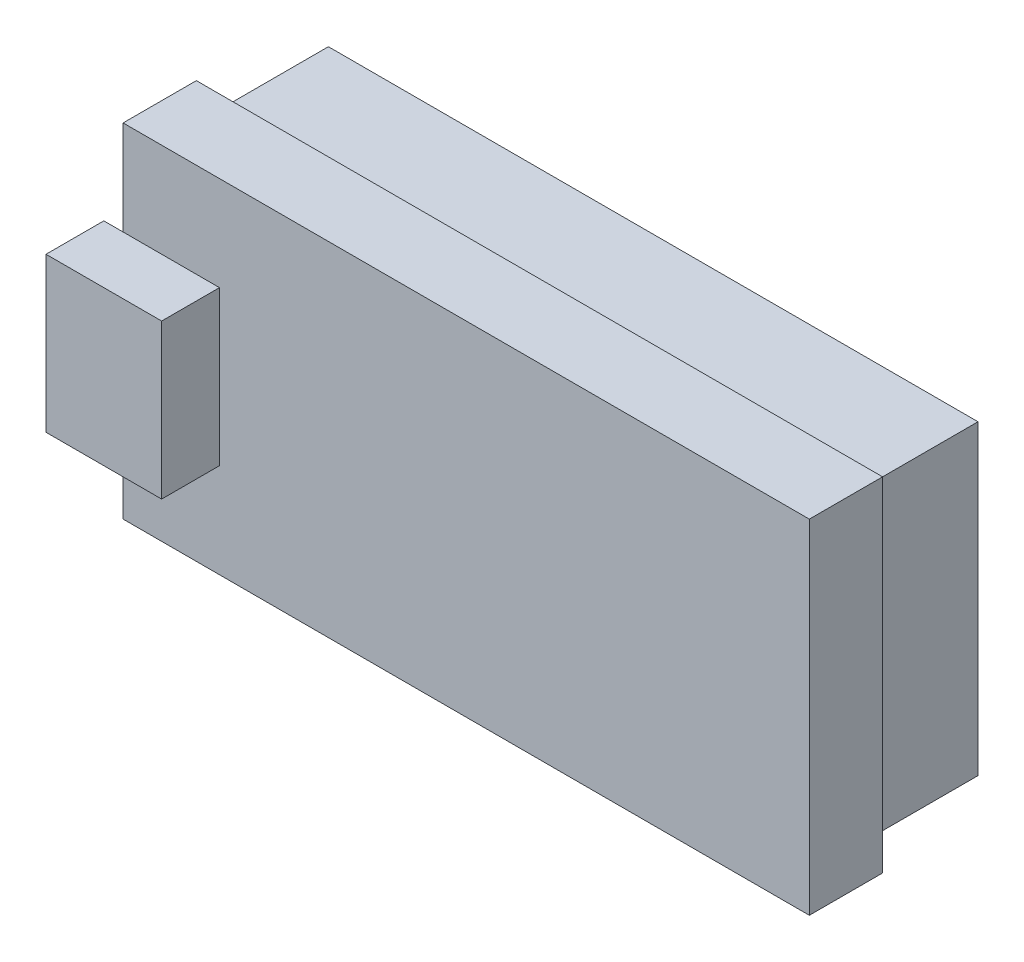
ISO-10303-21;
HEADER;
FILE_DESCRIPTION(('STEP AP214'),'2;1');
FILE_NAME('part.step','',(''),(''),'','','');
FILE_SCHEMA(('AUTOMOTIVE_DESIGN { 1 0 10303 214 1 1 1 1 }'));
ENDSEC;
DATA;
#1=APPLICATION_CONTEXT('core data for automotive mechanical design processes');
#2=APPLICATION_PROTOCOL_DEFINITION('international standard','automotive_design',2000,#1);
#3=PRODUCT_CONTEXT('',#1,'mechanical');
#4=PRODUCT('Part','Part','',(#3));
#5=PRODUCT_RELATED_PRODUCT_CATEGORY('part','',(#4));
#6=PRODUCT_DEFINITION_FORMATION('','',#4);
#7=PRODUCT_DEFINITION_CONTEXT('part definition',#1,'design');
#8=PRODUCT_DEFINITION('design','',#6,#7);
#9=PRODUCT_DEFINITION_SHAPE('','',#8);
#10=(LENGTH_UNIT() NAMED_UNIT(*) SI_UNIT(.MILLI.,.METRE.));
#11=(NAMED_UNIT(*) PLANE_ANGLE_UNIT() SI_UNIT($,.RADIAN.));
#12=(NAMED_UNIT(*) SI_UNIT($,.STERADIAN.) SOLID_ANGLE_UNIT());
#13=UNCERTAINTY_MEASURE_WITH_UNIT(LENGTH_MEASURE(1.E-05),#10,'distance_accuracy_value','');
#14=(GEOMETRIC_REPRESENTATION_CONTEXT(3) GLOBAL_UNCERTAINTY_ASSIGNED_CONTEXT((#13)) GLOBAL_UNIT_ASSIGNED_CONTEXT((#10,
#11,#12)) REPRESENTATION_CONTEXT('',''));
#15=CARTESIAN_POINT('',(0.,0.,0.));
#16=DIRECTION('',(0.,0.,1.));
#17=DIRECTION('',(1.,0.,0.));
#18=AXIS2_PLACEMENT_3D('',#15,#16,#17);
#19=CARTESIAN_POINT('',(0.,0.,-3.15));
#20=DIRECTION('',(0.,0.,-1.));
#21=DIRECTION('',(-1.,0.,0.));
#22=AXIS2_PLACEMENT_3D('',#19,#20,#21);
#23=PLANE('',#22);
#24=DIRECTION('',(0.,1.,0.));
#25=VECTOR('',#24,1.);
#26=CARTESIAN_POINT('',(-17.8,-6.4,-3.15));
#27=LINE('',#26,#25);
#28=CARTESIAN_POINT('',(-17.8,-8.9,-3.15));
#29=VERTEX_POINT('',#28);
#30=CARTESIAN_POINT('',(-17.8,-6.4,-3.15));
#31=VERTEX_POINT('',#30);
#32=EDGE_CURVE('E251',#29,#31,#27,.T.);
#33=ORIENTED_EDGE('',*,*,#32,.T.);
#34=DIRECTION('',(1.,0.,0.));
#35=VECTOR('',#34,1.);
#36=CARTESIAN_POINT('',(15.3,-6.4,-3.15));
#37=LINE('',#36,#35);
#38=CARTESIAN_POINT('',(15.3,-6.4,-3.15));
#39=VERTEX_POINT('',#38);
#40=EDGE_CURVE('E254',#31,#39,#37,.T.);
#41=ORIENTED_EDGE('',*,*,#40,.T.);
#42=DIRECTION('',(0.,1.,0.));
#43=VECTOR('',#42,1.);
#44=CARTESIAN_POINT('',(15.3,6.4,-3.15));
#45=LINE('',#44,#43);
#46=CARTESIAN_POINT('',(15.3,6.4,-3.15));
#47=VERTEX_POINT('',#46);
#48=EDGE_CURVE('E257',#39,#47,#45,.T.);
#49=ORIENTED_EDGE('',*,*,#48,.T.);
#50=DIRECTION('',(-1.,0.,0.));
#51=VECTOR('',#50,1.);
#52=CARTESIAN_POINT('',(-17.8,6.4,-3.15));
#53=LINE('',#52,#51);
#54=CARTESIAN_POINT('',(-17.8,6.4,-3.15));
#55=VERTEX_POINT('',#54);
#56=EDGE_CURVE('E259',#47,#55,#53,.T.);
#57=ORIENTED_EDGE('',*,*,#56,.T.);
#58=DIRECTION('',(0.,1.,0.));
#59=VECTOR('',#58,1.);
#60=CARTESIAN_POINT('',(-17.8,8.9,-3.15));
#61=LINE('',#60,#59);
#62=CARTESIAN_POINT('',(-17.8,8.9,-3.15));
#63=VERTEX_POINT('',#62);
#64=EDGE_CURVE('E261',#55,#63,#61,.T.);
#65=ORIENTED_EDGE('',*,*,#64,.T.);
#66=DIRECTION('',(1.,0.,0.));
#67=VECTOR('',#66,1.);
#68=CARTESIAN_POINT('',(-17.8,8.9,-3.15));
#69=LINE('',#68,#67);
#70=CARTESIAN_POINT('',(17.8,8.9,-3.15));
#71=VERTEX_POINT('',#70);
#72=EDGE_CURVE('E264',#63,#71,#69,.T.);
#73=ORIENTED_EDGE('',*,*,#72,.T.);
#74=DIRECTION('',(0.,-1.,0.));
#75=VECTOR('',#74,1.);
#76=CARTESIAN_POINT('',(17.8,8.9,-3.15));
#77=LINE('',#76,#75);
#78=CARTESIAN_POINT('',(17.8,-8.9,-3.15));
#79=VERTEX_POINT('',#78);
#80=EDGE_CURVE('E267',#71,#79,#77,.T.);
#81=ORIENTED_EDGE('',*,*,#80,.T.);
#82=DIRECTION('',(-1.,0.,0.));
#83=VECTOR('',#82,1.);
#84=CARTESIAN_POINT('',(17.8,-8.9,-3.15));
#85=LINE('',#84,#83);
#86=EDGE_CURVE('E270',#79,#29,#85,.T.);
#87=ORIENTED_EDGE('',*,*,#86,.T.);
#88=EDGE_LOOP('',(#33,#41,#49,#57,#65,#73,#81,#87));
#89=FACE_BOUND('',#88,.T.);
#90=DIRECTION('',(0.,1.,0.));
#91=VECTOR('',#90,1.);
#92=CARTESIAN_POINT('',(-16.85,-7.95,-3.15));
#93=LINE('',#92,#91);
#94=CARTESIAN_POINT('',(-16.85,-7.95,-3.15));
#95=VERTEX_POINT('',#94);
#96=CARTESIAN_POINT('',(-16.85,-7.35,-3.15));
#97=VERTEX_POINT('',#96);
#98=EDGE_CURVE('E203',#95,#97,#93,.T.);
#99=ORIENTED_EDGE('',*,*,#98,.F.);
#100=DIRECTION('',(-1.,0.,0.));
#101=VECTOR('',#100,1.);
#102=CARTESIAN_POINT('',(16.85,-7.95,-3.15));
#103=LINE('',#102,#101);
#104=CARTESIAN_POINT('',(16.85,-7.95,-3.15));
#105=VERTEX_POINT('',#104);
#106=EDGE_CURVE('E211',#105,#95,#103,.T.);
#107=ORIENTED_EDGE('',*,*,#106,.F.);
#108=DIRECTION('',(0.,-1.,0.));
#109=VECTOR('',#108,1.);
#110=CARTESIAN_POINT('',(16.85,7.95,-3.15));
#111=LINE('',#110,#109);
#112=CARTESIAN_POINT('',(16.85,7.95,-3.15));
#113=VERTEX_POINT('',#112);
#114=EDGE_CURVE('E237',#113,#105,#111,.T.);
#115=ORIENTED_EDGE('',*,*,#114,.F.);
#116=DIRECTION('',(1.,0.,0.));
#117=VECTOR('',#116,1.);
#118=CARTESIAN_POINT('',(-16.85,7.95,-3.15));
#119=LINE('',#118,#117);
#120=CARTESIAN_POINT('',(-16.85,7.95,-3.15));
#121=VERTEX_POINT('',#120);
#122=EDGE_CURVE('E234',#121,#113,#119,.T.);
#123=ORIENTED_EDGE('',*,*,#122,.F.);
#124=DIRECTION('',(0.,1.,0.));
#125=VECTOR('',#124,1.);
#126=CARTESIAN_POINT('',(-16.85,7.35,-3.15));
#127=LINE('',#126,#125);
#128=CARTESIAN_POINT('',(-16.85,7.35,-3.15));
#129=VERTEX_POINT('',#128);
#130=EDGE_CURVE('E231',#129,#121,#127,.T.);
#131=ORIENTED_EDGE('',*,*,#130,.F.);
#132=DIRECTION('',(-1.,0.,0.));
#133=VECTOR('',#132,1.);
#134=CARTESIAN_POINT('',(16.25,7.35,-3.15));
#135=LINE('',#134,#133);
#136=CARTESIAN_POINT('',(16.25,7.35,-3.15));
#137=VERTEX_POINT('',#136);
#138=EDGE_CURVE('E228',#137,#129,#135,.T.);
#139=ORIENTED_EDGE('',*,*,#138,.F.);
#140=DIRECTION('',(0.,1.,0.));
#141=VECTOR('',#140,1.);
#142=CARTESIAN_POINT('',(16.25,-7.35,-3.15));
#143=LINE('',#142,#141);
#144=CARTESIAN_POINT('',(16.25,-7.35,-3.15));
#145=VERTEX_POINT('',#144);
#146=EDGE_CURVE('E223',#145,#137,#143,.T.);
#147=ORIENTED_EDGE('',*,*,#146,.F.);
#148=DIRECTION('',(1.,0.,0.));
#149=VECTOR('',#148,1.);
#150=CARTESIAN_POINT('',(-16.85,-7.35,-3.15));
#151=LINE('',#150,#149);
#152=EDGE_CURVE('E221',#97,#145,#151,.T.);
#153=ORIENTED_EDGE('',*,*,#152,.F.);
#154=EDGE_LOOP('',(#99,#107,#115,#123,#131,#139,#147,#153));
#155=FACE_BOUND('',#154,.T.);
#156=ADVANCED_FACE('F33',(#89,#155),#23,.T.);
#157=CARTESIAN_POINT('',(0.,0.,-0.65));
#158=DIRECTION('',(0.,0.,1.));
#159=DIRECTION('',(1.,0.,0.));
#160=AXIS2_PLACEMENT_3D('',#157,#158,#159);
#161=PLANE('',#160);
#162=DIRECTION('',(-1.,0.,0.));
#163=VECTOR('',#162,1.);
#164=CARTESIAN_POINT('',(-17.8,6.4,-0.65));
#165=LINE('',#164,#163);
#166=CARTESIAN_POINT('',(15.3,6.4,-0.65));
#167=VERTEX_POINT('',#166);
#168=CARTESIAN_POINT('',(-17.8,6.4,-0.65));
#169=VERTEX_POINT('',#168);
#170=EDGE_CURVE('E255',#167,#169,#165,.T.);
#171=ORIENTED_EDGE('',*,*,#170,.F.);
#172=DIRECTION('',(0.,1.,0.));
#173=VECTOR('',#172,1.);
#174=CARTESIAN_POINT('',(15.3,6.4,-0.65));
#175=LINE('',#174,#173);
#176=CARTESIAN_POINT('',(15.3,-6.4,-0.65));
#177=VERTEX_POINT('',#176);
#178=EDGE_CURVE('E276',#177,#167,#175,.T.);
#179=ORIENTED_EDGE('',*,*,#178,.F.);
#180=DIRECTION('',(1.,0.,0.));
#181=VECTOR('',#180,1.);
#182=CARTESIAN_POINT('',(15.3,-6.4,-0.65));
#183=LINE('',#182,#181);
#184=CARTESIAN_POINT('',(-17.8,-6.4,-0.65));
#185=VERTEX_POINT('',#184);
#186=EDGE_CURVE('E207',#185,#177,#183,.T.);
#187=ORIENTED_EDGE('',*,*,#186,.F.);
#188=DIRECTION('',(0.,-1.,0.));
#189=VECTOR('',#188,1.);
#190=CARTESIAN_POINT('',(-17.8,8.9,-0.65));
#191=LINE('',#190,#189);
#192=EDGE_CURVE('E327',#169,#185,#191,.T.);
#193=ORIENTED_EDGE('',*,*,#192,.F.);
#194=EDGE_LOOP('',(#171,#179,#187,#193));
#195=FACE_BOUND('',#194,.T.);
#196=ADVANCED_FACE('F459',(#195),#161,.F.);
#197=CARTESIAN_POINT('',(-17.8,8.9,0.65));
#198=DIRECTION('',(1.,0.,0.));
#199=DIRECTION('',(0.,1.,0.));
#200=AXIS2_PLACEMENT_3D('',#197,#198,#199);
#201=PLANE('',#200);
#202=DIRECTION('',(0.,0.,-1.));
#203=VECTOR('',#202,1.);
#204=CARTESIAN_POINT('',(-17.8,8.9,0.65));
#205=LINE('',#204,#203);
#206=CARTESIAN_POINT('',(-17.8,8.9,0.65));
#207=VERTEX_POINT('',#206);
#208=EDGE_CURVE('E339',#207,#63,#205,.T.);
#209=ORIENTED_EDGE('',*,*,#208,.T.);
#210=ORIENTED_EDGE('',*,*,#64,.F.);
#211=DIRECTION('',(0.,0.,1.));
#212=VECTOR('',#211,1.);
#213=CARTESIAN_POINT('',(-17.8,6.4,-3.15));
#214=LINE('',#213,#212);
#215=EDGE_CURVE('E273',#55,#169,#214,.T.);
#216=ORIENTED_EDGE('',*,*,#215,.T.);
#217=ORIENTED_EDGE('',*,*,#192,.T.);
#218=DIRECTION('',(0.,0.,1.));
#219=VECTOR('',#218,1.);
#220=CARTESIAN_POINT('',(-17.8,-6.4,-3.15));
#221=LINE('',#220,#219);
#222=EDGE_CURVE('E289',#31,#185,#221,.T.);
#223=ORIENTED_EDGE('',*,*,#222,.F.);
#224=ORIENTED_EDGE('',*,*,#32,.F.);
#225=DIRECTION('',(0.,0.,-1.));
#226=VECTOR('',#225,1.);
#227=CARTESIAN_POINT('',(-17.8,-8.9,0.65));
#228=LINE('',#227,#226);
#229=CARTESIAN_POINT('',(-17.8,-8.9,0.65));
#230=VERTEX_POINT('',#229);
#231=EDGE_CURVE('E347',#230,#29,#228,.T.);
#232=ORIENTED_EDGE('',*,*,#231,.F.);
#233=DIRECTION('',(0.,-1.,0.));
#234=VECTOR('',#233,1.);
#235=CARTESIAN_POINT('',(-17.8,8.9,0.65));
#236=LINE('',#235,#234);
#237=CARTESIAN_POINT('',(-17.8,-4.,0.65));
#238=VERTEX_POINT('',#237);
#239=EDGE_CURVE('E333',#238,#230,#236,.T.);
#240=ORIENTED_EDGE('',*,*,#239,.F.);
#241=CARTESIAN_POINT('',(-17.8,4.,0.65));
#242=VERTEX_POINT('',#241);
#243=EDGE_CURVE('E332',#242,#238,#236,.T.);
#244=ORIENTED_EDGE('',*,*,#243,.F.);
#245=EDGE_CURVE('E328',#207,#242,#236,.T.);
#246=ORIENTED_EDGE('',*,*,#245,.F.);
#247=EDGE_LOOP('',(#209,#210,#216,#217,#223,#224,#232,#240,#244,#246));
#248=FACE_BOUND('',#247,.T.);
#249=ADVANCED_FACE('F467',(#248),#201,.F.);
#250=CARTESIAN_POINT('',(-17.8,-8.9,0.65));
#251=DIRECTION('',(0.,1.,0.));
#252=DIRECTION('',(0.,0.,1.));
#253=AXIS2_PLACEMENT_3D('',#250,#251,#252);
#254=PLANE('',#253);
#255=ORIENTED_EDGE('',*,*,#231,.T.);
#256=ORIENTED_EDGE('',*,*,#86,.F.);
#257=DIRECTION('',(0.,0.,-1.));
#258=VECTOR('',#257,1.);
#259=CARTESIAN_POINT('',(17.8,-8.9,0.65));
#260=LINE('',#259,#258);
#261=CARTESIAN_POINT('',(17.8,-8.9,0.65));
#262=VERTEX_POINT('',#261);
#263=EDGE_CURVE('E345',#262,#79,#260,.T.);
#264=ORIENTED_EDGE('',*,*,#263,.F.);
#265=DIRECTION('',(1.,0.,0.));
#266=VECTOR('',#265,1.);
#267=CARTESIAN_POINT('',(-17.8,-8.9,0.65));
#268=LINE('',#267,#266);
#269=EDGE_CURVE('E331',#230,#262,#268,.T.);
#270=ORIENTED_EDGE('',*,*,#269,.F.);
#271=EDGE_LOOP('',(#255,#256,#264,#270));
#272=FACE_BOUND('',#271,.T.);
#273=ADVANCED_FACE('F520',(#272),#254,.F.);
#274=CARTESIAN_POINT('',(17.8,8.9,0.65));
#275=DIRECTION('',(-1.,0.,0.));
#276=DIRECTION('',(0.,0.,1.));
#277=AXIS2_PLACEMENT_3D('',#274,#275,#276);
#278=PLANE('',#277);
#279=ORIENTED_EDGE('',*,*,#263,.T.);
#280=ORIENTED_EDGE('',*,*,#80,.F.);
#281=DIRECTION('',(0.,0.,-1.));
#282=VECTOR('',#281,1.);
#283=CARTESIAN_POINT('',(17.8,8.9,0.65));
#284=LINE('',#283,#282);
#285=CARTESIAN_POINT('',(17.8,8.9,0.65));
#286=VERTEX_POINT('',#285);
#287=EDGE_CURVE('E343',#286,#71,#284,.T.);
#288=ORIENTED_EDGE('',*,*,#287,.F.);
#289=DIRECTION('',(0.,1.,0.));
#290=VECTOR('',#289,1.);
#291=CARTESIAN_POINT('',(17.8,8.9,0.65));
#292=LINE('',#291,#290);
#293=EDGE_CURVE('E335',#262,#286,#292,.T.);
#294=ORIENTED_EDGE('',*,*,#293,.F.);
#295=EDGE_LOOP('',(#279,#280,#288,#294));
#296=FACE_BOUND('',#295,.T.);
#297=ADVANCED_FACE('F516',(#296),#278,.F.);
#298=CARTESIAN_POINT('',(-17.8,8.9,0.65));
#299=DIRECTION('',(0.,-1.,0.));
#300=DIRECTION('',(0.,0.,-1.));
#301=AXIS2_PLACEMENT_3D('',#298,#299,#300);
#302=PLANE('',#301);
#303=ORIENTED_EDGE('',*,*,#287,.T.);
#304=ORIENTED_EDGE('',*,*,#72,.F.);
#305=ORIENTED_EDGE('',*,*,#208,.F.);
#306=DIRECTION('',(-1.,0.,0.));
#307=VECTOR('',#306,1.);
#308=CARTESIAN_POINT('',(-17.8,8.9,0.65));
#309=LINE('',#308,#307);
#310=EDGE_CURVE('E337',#286,#207,#309,.T.);
#311=ORIENTED_EDGE('',*,*,#310,.F.);
#312=EDGE_LOOP('',(#303,#304,#305,#311));
#313=FACE_BOUND('',#312,.T.);
#314=ADVANCED_FACE('F511',(#313),#302,.F.);
#315=CARTESIAN_POINT('',(0.,0.,0.65));
#316=DIRECTION('',(0.,0.,1.));
#317=DIRECTION('',(1.,0.,0.));
#318=AXIS2_PLACEMENT_3D('',#315,#316,#317);
#319=PLANE('',#318);
#320=DIRECTION('',(-1.,0.,0.));
#321=VECTOR('',#320,1.);
#322=CARTESIAN_POINT('',(-18.8,4.,0.65));
#323=LINE('',#322,#321);
#324=CARTESIAN_POINT('',(-12.8,4.,0.65));
#325=VERTEX_POINT('',#324);
#326=EDGE_CURVE('E297',#325,#242,#323,.T.);
#327=ORIENTED_EDGE('',*,*,#326,.F.);
#328=DIRECTION('',(0.,1.,0.));
#329=VECTOR('',#328,1.);
#330=CARTESIAN_POINT('',(-12.8,-4.,0.65));
#331=LINE('',#330,#329);
#332=CARTESIAN_POINT('',(-12.8,-4.,0.65));
#333=VERTEX_POINT('',#332);
#334=EDGE_CURVE('E309',#333,#325,#331,.T.);
#335=ORIENTED_EDGE('',*,*,#334,.F.);
#336=DIRECTION('',(1.,0.,0.));
#337=VECTOR('',#336,1.);
#338=CARTESIAN_POINT('',(-18.8,-4.,0.65));
#339=LINE('',#338,#337);
#340=EDGE_CURVE('E310',#238,#333,#339,.T.);
#341=ORIENTED_EDGE('',*,*,#340,.F.);
#342=ORIENTED_EDGE('',*,*,#239,.T.);
#343=ORIENTED_EDGE('',*,*,#269,.T.);
#344=ORIENTED_EDGE('',*,*,#293,.T.);
#345=ORIENTED_EDGE('',*,*,#310,.T.);
#346=ORIENTED_EDGE('',*,*,#245,.T.);
#347=EDGE_LOOP('',(#327,#335,#341,#342,#343,#344,#345,#346));
#348=FACE_BOUND('',#347,.T.);
#349=ADVANCED_FACE('F508',(#348),#319,.T.);
#350=CARTESIAN_POINT('',(-18.8,-4.,3.65));
#351=DIRECTION('',(1.,0.,0.));
#352=DIRECTION('',(0.,0.,-1.));
#353=AXIS2_PLACEMENT_3D('',#350,#351,#352);
#354=PLANE('',#353);
#355=DIRECTION('',(0.,-1.,0.));
#356=VECTOR('',#355,1.);
#357=CARTESIAN_POINT('',(-18.8,-4.,0.65));
#358=LINE('',#357,#356);
#359=CARTESIAN_POINT('',(-18.8,4.,0.65));
#360=VERTEX_POINT('',#359);
#361=CARTESIAN_POINT('',(-18.8,-4.,0.65));
#362=VERTEX_POINT('',#361);
#363=EDGE_CURVE('E292',#360,#362,#358,.T.);
#364=ORIENTED_EDGE('',*,*,#363,.T.);
#365=DIRECTION('',(0.,0.,-1.));
#366=VECTOR('',#365,1.);
#367=CARTESIAN_POINT('',(-18.8,-4.,3.65));
#368=LINE('',#367,#366);
#369=CARTESIAN_POINT('',(-18.8,-4.,3.65));
#370=VERTEX_POINT('',#369);
#371=EDGE_CURVE('E324',#370,#362,#368,.T.);
#372=ORIENTED_EDGE('',*,*,#371,.F.);
#373=DIRECTION('',(0.,-1.,0.));
#374=VECTOR('',#373,1.);
#375=CARTESIAN_POINT('',(-18.8,-4.,3.65));
#376=LINE('',#375,#374);
#377=CARTESIAN_POINT('',(-18.8,4.,3.65));
#378=VERTEX_POINT('',#377);
#379=EDGE_CURVE('E293',#378,#370,#376,.T.);
#380=ORIENTED_EDGE('',*,*,#379,.F.);
#381=DIRECTION('',(0.,0.,-1.));
#382=VECTOR('',#381,1.);
#383=CARTESIAN_POINT('',(-18.8,4.,3.65));
#384=LINE('',#383,#382);
#385=EDGE_CURVE('E303',#378,#360,#384,.T.);
#386=ORIENTED_EDGE('',*,*,#385,.T.);
#387=EDGE_LOOP('',(#364,#372,#380,#386));
#388=FACE_BOUND('',#387,.T.);
#389=ADVANCED_FACE('F504',(#388),#354,.F.);
#390=CARTESIAN_POINT('',(-18.8,-4.,3.65));
#391=DIRECTION('',(0.,1.,0.));
#392=DIRECTION('',(0.,0.,1.));
#393=AXIS2_PLACEMENT_3D('',#390,#391,#392);
#394=PLANE('',#393);
#395=EDGE_CURVE('E306',#362,#238,#339,.T.);
#396=ORIENTED_EDGE('',*,*,#395,.T.);
#397=ORIENTED_EDGE('',*,*,#340,.T.);
#398=DIRECTION('',(0.,0.,-1.));
#399=VECTOR('',#398,1.);
#400=CARTESIAN_POINT('',(-12.8,-4.,3.65));
#401=LINE('',#400,#399);
#402=CARTESIAN_POINT('',(-12.8,-4.,3.65));
#403=VERTEX_POINT('',#402);
#404=EDGE_CURVE('E321',#403,#333,#401,.T.);
#405=ORIENTED_EDGE('',*,*,#404,.F.);
#406=DIRECTION('',(1.,0.,0.));
#407=VECTOR('',#406,1.);
#408=CARTESIAN_POINT('',(-18.8,-4.,3.65));
#409=LINE('',#408,#407);
#410=EDGE_CURVE('E296',#370,#403,#409,.T.);
#411=ORIENTED_EDGE('',*,*,#410,.F.);
#412=ORIENTED_EDGE('',*,*,#371,.T.);
#413=EDGE_LOOP('',(#396,#397,#405,#411,#412));
#414=FACE_BOUND('',#413,.T.);
#415=ADVANCED_FACE('F500',(#414),#394,.F.);
#416=CARTESIAN_POINT('',(-12.8,-4.,3.65));
#417=DIRECTION('',(-1.,0.,0.));
#418=DIRECTION('',(0.,0.,1.));
#419=AXIS2_PLACEMENT_3D('',#416,#417,#418);
#420=PLANE('',#419);
#421=ORIENTED_EDGE('',*,*,#334,.T.);
#422=DIRECTION('',(0.,0.,-1.));
#423=VECTOR('',#422,1.);
#424=CARTESIAN_POINT('',(-12.8,4.,3.65));
#425=LINE('',#424,#423);
#426=CARTESIAN_POINT('',(-12.8,4.,3.65));
#427=VERTEX_POINT('',#426);
#428=EDGE_CURVE('E318',#427,#325,#425,.T.);
#429=ORIENTED_EDGE('',*,*,#428,.F.);
#430=DIRECTION('',(0.,1.,0.));
#431=VECTOR('',#430,1.);
#432=CARTESIAN_POINT('',(-12.8,-4.,3.65));
#433=LINE('',#432,#431);
#434=EDGE_CURVE('E299',#403,#427,#433,.T.);
#435=ORIENTED_EDGE('',*,*,#434,.F.);
#436=ORIENTED_EDGE('',*,*,#404,.T.);
#437=EDGE_LOOP('',(#421,#429,#435,#436));
#438=FACE_BOUND('',#437,.T.);
#439=ADVANCED_FACE('F496',(#438),#420,.F.);
#440=CARTESIAN_POINT('',(-18.8,4.,3.65));
#441=DIRECTION('',(0.,-1.,0.));
#442=DIRECTION('',(0.,0.,-1.));
#443=AXIS2_PLACEMENT_3D('',#440,#441,#442);
#444=PLANE('',#443);
#445=ORIENTED_EDGE('',*,*,#326,.T.);
#446=EDGE_CURVE('E313',#242,#360,#323,.T.);
#447=ORIENTED_EDGE('',*,*,#446,.T.);
#448=ORIENTED_EDGE('',*,*,#385,.F.);
#449=DIRECTION('',(-1.,0.,0.));
#450=VECTOR('',#449,1.);
#451=CARTESIAN_POINT('',(-18.8,4.,3.65));
#452=LINE('',#451,#450);
#453=EDGE_CURVE('E301',#427,#378,#452,.T.);
#454=ORIENTED_EDGE('',*,*,#453,.F.);
#455=ORIENTED_EDGE('',*,*,#428,.T.);
#456=EDGE_LOOP('',(#445,#447,#448,#454,#455));
#457=FACE_BOUND('',#456,.T.);
#458=ADVANCED_FACE('F489',(#457),#444,.F.);
#459=CARTESIAN_POINT('',(0.,0.,3.65));
#460=DIRECTION('',(0.,0.,-1.));
#461=DIRECTION('',(-1.,0.,0.));
#462=AXIS2_PLACEMENT_3D('',#459,#460,#461);
#463=PLANE('',#462);
#464=ORIENTED_EDGE('',*,*,#379,.T.);
#465=ORIENTED_EDGE('',*,*,#410,.T.);
#466=ORIENTED_EDGE('',*,*,#434,.T.);
#467=ORIENTED_EDGE('',*,*,#453,.T.);
#468=EDGE_LOOP('',(#464,#465,#466,#467));
#469=FACE_BOUND('',#468,.T.);
#470=ADVANCED_FACE('F486',(#469),#463,.F.);
#471=CARTESIAN_POINT('',(0.,0.,0.65));
#472=DIRECTION('',(0.,0.,-1.));
#473=DIRECTION('',(-1.,0.,0.));
#474=AXIS2_PLACEMENT_3D('',#471,#472,#473);
#475=PLANE('',#474);
#476=ORIENTED_EDGE('',*,*,#446,.F.);
#477=ORIENTED_EDGE('',*,*,#243,.T.);
#478=ORIENTED_EDGE('',*,*,#395,.F.);
#479=ORIENTED_EDGE('',*,*,#363,.F.);
#480=EDGE_LOOP('',(#476,#477,#478,#479));
#481=FACE_BOUND('',#480,.T.);
#482=ADVANCED_FACE('F484',(#481),#475,.T.);
#483=CARTESIAN_POINT('',(15.3,-6.4,-3.15));
#484=DIRECTION('',(0.,-1.,0.));
#485=DIRECTION('',(0.,0.,-1.));
#486=AXIS2_PLACEMENT_3D('',#483,#484,#485);
#487=PLANE('',#486);
#488=ORIENTED_EDGE('',*,*,#186,.T.);
#489=DIRECTION('',(0.,0.,1.));
#490=VECTOR('',#489,1.);
#491=CARTESIAN_POINT('',(15.3,-6.4,-3.15));
#492=LINE('',#491,#490);
#493=EDGE_CURVE('E286',#39,#177,#492,.T.);
#494=ORIENTED_EDGE('',*,*,#493,.F.);
#495=ORIENTED_EDGE('',*,*,#40,.F.);
#496=ORIENTED_EDGE('',*,*,#222,.T.);
#497=EDGE_LOOP('',(#488,#494,#495,#496));
#498=FACE_BOUND('',#497,.T.);
#499=ADVANCED_FACE('F480',(#498),#487,.F.);
#500=CARTESIAN_POINT('',(15.3,6.4,-3.15));
#501=DIRECTION('',(1.,0.,0.));
#502=DIRECTION('',(0.,0.,-1.));
#503=AXIS2_PLACEMENT_3D('',#500,#501,#502);
#504=PLANE('',#503);
#505=ORIENTED_EDGE('',*,*,#178,.T.);
#506=DIRECTION('',(0.,0.,1.));
#507=VECTOR('',#506,1.);
#508=CARTESIAN_POINT('',(15.3,6.4,-3.15));
#509=LINE('',#508,#507);
#510=EDGE_CURVE('E283',#47,#167,#509,.T.);
#511=ORIENTED_EDGE('',*,*,#510,.F.);
#512=ORIENTED_EDGE('',*,*,#48,.F.);
#513=ORIENTED_EDGE('',*,*,#493,.T.);
#514=EDGE_LOOP('',(#505,#511,#512,#513));
#515=FACE_BOUND('',#514,.T.);
#516=ADVANCED_FACE('F476',(#515),#504,.F.);
#517=CARTESIAN_POINT('',(-17.8,6.4,-3.15));
#518=DIRECTION('',(0.,1.,0.));
#519=DIRECTION('',(0.,0.,1.));
#520=AXIS2_PLACEMENT_3D('',#517,#518,#519);
#521=PLANE('',#520);
#522=ORIENTED_EDGE('',*,*,#170,.T.);
#523=ORIENTED_EDGE('',*,*,#215,.F.);
#524=ORIENTED_EDGE('',*,*,#56,.F.);
#525=ORIENTED_EDGE('',*,*,#510,.T.);
#526=EDGE_LOOP('',(#522,#523,#524,#525));
#527=FACE_BOUND('',#526,.T.);
#528=ADVANCED_FACE('F473',(#527),#521,.F.);
#529=CARTESIAN_POINT('',(16.85,-7.95,-9.25));
#530=DIRECTION('',(0.,1.,0.));
#531=DIRECTION('',(0.,0.,1.));
#532=AXIS2_PLACEMENT_3D('',#529,#530,#531);
#533=PLANE('',#532);
#534=DIRECTION('',(0.,0.,1.));
#535=VECTOR('',#534,1.);
#536=CARTESIAN_POINT('',(-16.85,-7.95,-9.25));
#537=LINE('',#536,#535);
#538=CARTESIAN_POINT('',(-16.85,-7.95,-9.05));
#539=VERTEX_POINT('',#538);
#540=EDGE_CURVE('E199',#539,#95,#537,.T.);
#541=ORIENTED_EDGE('',*,*,#540,.F.);
#542=DIRECTION('',(1.,0.,0.));
#543=VECTOR('',#542,1.);
#544=CARTESIAN_POINT('',(16.85,-7.95,-9.05));
#545=LINE('',#544,#543);
#546=CARTESIAN_POINT('',(16.85,-7.95,-9.05));
#547=VERTEX_POINT('',#546);
#548=EDGE_CURVE('E11',#539,#547,#545,.T.);
#549=ORIENTED_EDGE('',*,*,#548,.T.);
#550=DIRECTION('',(0.,0.,1.));
#551=VECTOR('',#550,1.);
#552=CARTESIAN_POINT('',(16.85,-7.95,-9.25));
#553=LINE('',#552,#551);
#554=EDGE_CURVE('E214',#547,#105,#553,.T.);
#555=ORIENTED_EDGE('',*,*,#554,.T.);
#556=ORIENTED_EDGE('',*,*,#106,.T.);
#557=EDGE_LOOP('',(#541,#549,#555,#556));
#558=FACE_BOUND('',#557,.T.);
#559=ADVANCED_FACE('F212',(#558),#533,.F.);
#560=CARTESIAN_POINT('',(-16.85,-7.95,-9.25));
#561=DIRECTION('',(1.,0.,0.));
#562=DIRECTION('',(0.,1.,0.));
#563=AXIS2_PLACEMENT_3D('',#560,#561,#562);
#564=PLANE('',#563);
#565=DIRECTION('',(0.,0.,1.));
#566=VECTOR('',#565,1.);
#567=CARTESIAN_POINT('',(-16.85,-7.35,-9.25));
#568=LINE('',#567,#566);
#569=CARTESIAN_POINT('',(-16.85,-7.35,-9.05));
#570=VERTEX_POINT('',#569);
#571=EDGE_CURVE('E208',#570,#97,#568,.T.);
#572=ORIENTED_EDGE('',*,*,#571,.F.);
#573=DIRECTION('',(0.,-1.,0.));
#574=VECTOR('',#573,1.);
#575=CARTESIAN_POINT('',(-16.85,-7.95,-9.05));
#576=LINE('',#575,#574);
#577=EDGE_CURVE('E42',#570,#539,#576,.T.);
#578=ORIENTED_EDGE('',*,*,#577,.T.);
#579=ORIENTED_EDGE('',*,*,#540,.T.);
#580=ORIENTED_EDGE('',*,*,#98,.T.);
#581=EDGE_LOOP('',(#572,#578,#579,#580));
#582=FACE_BOUND('',#581,.T.);
#583=ADVANCED_FACE('F201',(#582),#564,.F.);
#584=CARTESIAN_POINT('',(-16.85,-7.35,-9.25));
#585=DIRECTION('',(0.,-1.,0.));
#586=DIRECTION('',(0.,0.,-1.));
#587=AXIS2_PLACEMENT_3D('',#584,#585,#586);
#588=PLANE('',#587);
#589=DIRECTION('',(0.,0.,1.));
#590=VECTOR('',#589,1.);
#591=CARTESIAN_POINT('',(16.25,-7.35,-9.25));
#592=LINE('',#591,#590);
#593=CARTESIAN_POINT('',(16.25,-7.35,-9.05));
#594=VERTEX_POINT('',#593);
#595=EDGE_CURVE('E248',#594,#145,#592,.T.);
#596=ORIENTED_EDGE('',*,*,#595,.F.);
#597=DIRECTION('',(-1.,0.,0.));
#598=VECTOR('',#597,1.);
#599=CARTESIAN_POINT('',(-16.85,-7.35,-9.05));
#600=LINE('',#599,#598);
#601=EDGE_CURVE('E57',#594,#570,#600,.T.);
#602=ORIENTED_EDGE('',*,*,#601,.T.);
#603=ORIENTED_EDGE('',*,*,#571,.T.);
#604=ORIENTED_EDGE('',*,*,#152,.T.);
#605=EDGE_LOOP('',(#596,#602,#603,#604));
#606=FACE_BOUND('',#605,.T.);
#607=ADVANCED_FACE('F412',(#606),#588,.F.);
#608=CARTESIAN_POINT('',(16.25,-7.35,-9.25));
#609=DIRECTION('',(1.,0.,0.));
#610=DIRECTION('',(0.,0.,-1.));
#611=AXIS2_PLACEMENT_3D('',#608,#609,#610);
#612=PLANE('',#611);
#613=DIRECTION('',(0.,0.,1.));
#614=VECTOR('',#613,1.);
#615=CARTESIAN_POINT('',(16.25,7.35,-9.25));
#616=LINE('',#615,#614);
#617=CARTESIAN_POINT('',(16.25,7.35,-9.05));
#618=VERTEX_POINT('',#617);
#619=EDGE_CURVE('E246',#618,#137,#616,.T.);
#620=ORIENTED_EDGE('',*,*,#619,.F.);
#621=DIRECTION('',(0.,-1.,0.));
#622=VECTOR('',#621,1.);
#623=CARTESIAN_POINT('',(16.25,-7.35,-9.05));
#624=LINE('',#623,#622);
#625=EDGE_CURVE('E375',#618,#594,#624,.T.);
#626=ORIENTED_EDGE('',*,*,#625,.T.);
#627=ORIENTED_EDGE('',*,*,#595,.T.);
#628=ORIENTED_EDGE('',*,*,#146,.T.);
#629=EDGE_LOOP('',(#620,#626,#627,#628));
#630=FACE_BOUND('',#629,.T.);
#631=ADVANCED_FACE('F411',(#630),#612,.F.);
#632=CARTESIAN_POINT('',(16.25,7.35,-9.25));
#633=DIRECTION('',(0.,1.,0.));
#634=DIRECTION('',(0.,0.,1.));
#635=AXIS2_PLACEMENT_3D('',#632,#633,#634);
#636=PLANE('',#635);
#637=DIRECTION('',(0.,0.,1.));
#638=VECTOR('',#637,1.);
#639=CARTESIAN_POINT('',(-16.85,7.35,-9.25));
#640=LINE('',#639,#638);
#641=CARTESIAN_POINT('',(-16.85,7.35,-9.05));
#642=VERTEX_POINT('',#641);
#643=EDGE_CURVE('E244',#642,#129,#640,.T.);
#644=ORIENTED_EDGE('',*,*,#643,.F.);
#645=DIRECTION('',(1.,0.,0.));
#646=VECTOR('',#645,1.);
#647=CARTESIAN_POINT('',(16.25,7.35,-9.05));
#648=LINE('',#647,#646);
#649=EDGE_CURVE('E373',#642,#618,#648,.T.);
#650=ORIENTED_EDGE('',*,*,#649,.T.);
#651=ORIENTED_EDGE('',*,*,#619,.T.);
#652=ORIENTED_EDGE('',*,*,#138,.T.);
#653=EDGE_LOOP('',(#644,#650,#651,#652));
#654=FACE_BOUND('',#653,.T.);
#655=ADVANCED_FACE('F418',(#654),#636,.F.);
#656=CARTESIAN_POINT('',(-16.85,7.35,-9.25));
#657=DIRECTION('',(1.,0.,0.));
#658=DIRECTION('',(0.,0.,-1.));
#659=AXIS2_PLACEMENT_3D('',#656,#657,#658);
#660=PLANE('',#659);
#661=DIRECTION('',(0.,0.,1.));
#662=VECTOR('',#661,1.);
#663=CARTESIAN_POINT('',(-16.85,7.95,-9.25));
#664=LINE('',#663,#662);
#665=CARTESIAN_POINT('',(-16.85,7.95,-9.05));
#666=VERTEX_POINT('',#665);
#667=EDGE_CURVE('E242',#666,#121,#664,.T.);
#668=ORIENTED_EDGE('',*,*,#667,.F.);
#669=DIRECTION('',(0.,-1.,0.));
#670=VECTOR('',#669,1.);
#671=CARTESIAN_POINT('',(-16.85,7.35,-9.05));
#672=LINE('',#671,#670);
#673=EDGE_CURVE('E371',#666,#642,#672,.T.);
#674=ORIENTED_EDGE('',*,*,#673,.T.);
#675=ORIENTED_EDGE('',*,*,#643,.T.);
#676=ORIENTED_EDGE('',*,*,#130,.T.);
#677=EDGE_LOOP('',(#668,#674,#675,#676));
#678=FACE_BOUND('',#677,.T.);
#679=ADVANCED_FACE('F421',(#678),#660,.F.);
#680=CARTESIAN_POINT('',(-16.85,7.95,-9.25));
#681=DIRECTION('',(0.,-1.,0.));
#682=DIRECTION('',(0.,0.,-1.));
#683=AXIS2_PLACEMENT_3D('',#680,#681,#682);
#684=PLANE('',#683);
#685=DIRECTION('',(0.,0.,1.));
#686=VECTOR('',#685,1.);
#687=CARTESIAN_POINT('',(16.85,7.95,-9.25));
#688=LINE('',#687,#686);
#689=CARTESIAN_POINT('',(16.85,7.95,-9.05));
#690=VERTEX_POINT('',#689);
#691=EDGE_CURVE('E240',#690,#113,#688,.T.);
#692=ORIENTED_EDGE('',*,*,#691,.F.);
#693=DIRECTION('',(-1.,0.,0.));
#694=VECTOR('',#693,1.);
#695=CARTESIAN_POINT('',(-16.85,7.95,-9.05));
#696=LINE('',#695,#694);
#697=EDGE_CURVE('E369',#690,#666,#696,.T.);
#698=ORIENTED_EDGE('',*,*,#697,.T.);
#699=ORIENTED_EDGE('',*,*,#667,.T.);
#700=ORIENTED_EDGE('',*,*,#122,.T.);
#701=EDGE_LOOP('',(#692,#698,#699,#700));
#702=FACE_BOUND('',#701,.T.);
#703=ADVANCED_FACE('F616',(#702),#684,.F.);
#704=CARTESIAN_POINT('',(16.85,7.95,-9.25));
#705=DIRECTION('',(-1.,0.,0.));
#706=DIRECTION('',(0.,0.,1.));
#707=AXIS2_PLACEMENT_3D('',#704,#705,#706);
#708=PLANE('',#707);
#709=ORIENTED_EDGE('',*,*,#554,.F.);
#710=DIRECTION('',(0.,1.,0.));
#711=VECTOR('',#710,1.);
#712=CARTESIAN_POINT('',(16.85,7.95,-9.05));
#713=LINE('',#712,#711);
#714=EDGE_CURVE('E366',#547,#690,#713,.T.);
#715=ORIENTED_EDGE('',*,*,#714,.T.);
#716=ORIENTED_EDGE('',*,*,#691,.T.);
#717=ORIENTED_EDGE('',*,*,#114,.T.);
#718=EDGE_LOOP('',(#709,#715,#716,#717));
#719=FACE_BOUND('',#718,.T.);
#720=ADVANCED_FACE('F447',(#719),#708,.F.);
#721=CARTESIAN_POINT('',(0.,0.,-9.25));
#722=DIRECTION('',(0.,0.,-1.));
#723=DIRECTION('',(-1.,0.,0.));
#724=AXIS2_PLACEMENT_3D('',#721,#722,#723);
#725=PLANE('',#724);
#726=DIRECTION('',(1.,0.,0.));
#727=VECTOR('',#726,1.);
#728=CARTESIAN_POINT('',(16.85,7.75,-9.25));
#729=LINE('',#728,#727);
#730=CARTESIAN_POINT('',(-16.65,7.75,-9.25));
#731=VERTEX_POINT('',#730);
#732=CARTESIAN_POINT('',(16.65,7.75,-9.25));
#733=VERTEX_POINT('',#732);
#734=EDGE_CURVE('E361',#731,#733,#729,.T.);
#735=ORIENTED_EDGE('',*,*,#734,.T.);
#736=DIRECTION('',(0.,-1.,0.));
#737=VECTOR('',#736,1.);
#738=CARTESIAN_POINT('',(16.65,-7.95,-9.25));
#739=LINE('',#738,#737);
#740=CARTESIAN_POINT('',(16.65,-7.75,-9.25));
#741=VERTEX_POINT('',#740);
#742=EDGE_CURVE('E363',#733,#741,#739,.T.);
#743=ORIENTED_EDGE('',*,*,#742,.T.);
#744=DIRECTION('',(-1.,0.,0.));
#745=VECTOR('',#744,1.);
#746=CARTESIAN_POINT('',(-16.85,-7.75,-9.25));
#747=LINE('',#746,#745);
#748=CARTESIAN_POINT('',(-16.65,-7.75,-9.25));
#749=VERTEX_POINT('',#748);
#750=EDGE_CURVE('E349',#741,#749,#747,.T.);
#751=ORIENTED_EDGE('',*,*,#750,.T.);
#752=DIRECTION('',(0.,1.,0.));
#753=VECTOR('',#752,1.);
#754=CARTESIAN_POINT('',(-16.65,-7.35,-9.25));
#755=LINE('',#754,#753);
#756=CARTESIAN_POINT('',(-16.65,-7.55,-9.25));
#757=VERTEX_POINT('',#756);
#758=EDGE_CURVE('E351',#749,#757,#755,.T.);
#759=ORIENTED_EDGE('',*,*,#758,.T.);
#760=DIRECTION('',(1.,0.,0.));
#761=VECTOR('',#760,1.);
#762=CARTESIAN_POINT('',(16.25,-7.55,-9.25));
#763=LINE('',#762,#761);
#764=CARTESIAN_POINT('',(16.45,-7.55,-9.25));
#765=VERTEX_POINT('',#764);
#766=EDGE_CURVE('E353',#757,#765,#763,.T.);
#767=ORIENTED_EDGE('',*,*,#766,.T.);
#768=DIRECTION('',(0.,1.,0.));
#769=VECTOR('',#768,1.);
#770=CARTESIAN_POINT('',(16.45,7.35,-9.25));
#771=LINE('',#770,#769);
#772=CARTESIAN_POINT('',(16.45,7.55,-9.25));
#773=VERTEX_POINT('',#772);
#774=EDGE_CURVE('E355',#765,#773,#771,.T.);
#775=ORIENTED_EDGE('',*,*,#774,.T.);
#776=DIRECTION('',(-1.,0.,0.));
#777=VECTOR('',#776,1.);
#778=CARTESIAN_POINT('',(-16.85,7.55,-9.25));
#779=LINE('',#778,#777);
#780=CARTESIAN_POINT('',(-16.65,7.55,-9.25));
#781=VERTEX_POINT('',#780);
#782=EDGE_CURVE('E357',#773,#781,#779,.T.);
#783=ORIENTED_EDGE('',*,*,#782,.T.);
#784=DIRECTION('',(0.,1.,0.));
#785=VECTOR('',#784,1.);
#786=CARTESIAN_POINT('',(-16.65,7.95,-9.25));
#787=LINE('',#786,#785);
#788=EDGE_CURVE('E359',#781,#731,#787,.T.);
#789=ORIENTED_EDGE('',*,*,#788,.T.);
#790=EDGE_LOOP('',(#735,#743,#751,#759,#767,#775,#783,#789));
#791=FACE_BOUND('',#790,.T.);
#792=ADVANCED_FACE('F434',(#791),#725,.T.);
#793=CARTESIAN_POINT('',(16.45,0.,-9.25));
#794=DIRECTION('',(-0.707106781186541,0.,-0.707106781186554));
#795=DIRECTION('',(0.,-1.,0.));
#796=AXIS2_PLACEMENT_3D('',#793,#794,#795);
#797=PLANE('',#796);
#798=DIRECTION('',(0.577350269189629,-0.577350269189629,-0.577350269189619));
#799=VECTOR('',#798,1.);
#800=CARTESIAN_POINT('',(13.9333333333333,-5.0333333333333,-6.73333333333335));
#801=LINE('',#800,#799);
#802=EDGE_CURVE('E394',#594,#765,#801,.T.);
#803=ORIENTED_EDGE('',*,*,#802,.F.);
#804=ORIENTED_EDGE('',*,*,#625,.F.);
#805=DIRECTION('',(0.577350269189629,0.577350269189629,-0.577350269189619));
#806=VECTOR('',#805,1.);
#807=CARTESIAN_POINT('',(10.9666666666666,2.06666666666661,-3.7666666666667));
#808=LINE('',#807,#806);
#809=EDGE_CURVE('E37',#773,#618,#808,.F.);
#810=ORIENTED_EDGE('',*,*,#809,.F.);
#811=ORIENTED_EDGE('',*,*,#774,.F.);
#812=EDGE_LOOP('',(#803,#804,#810,#811));
#813=FACE_BOUND('',#812,.T.);
#814=ADVANCED_FACE('F35',(#813),#797,.T.);
#815=CARTESIAN_POINT('',(0.,7.55,-9.25));
#816=DIRECTION('',(0.,-0.707106781186541,-0.707106781186554));
#817=DIRECTION('',(1.,0.,0.));
#818=AXIS2_PLACEMENT_3D('',#815,#816,#817);
#819=PLANE('',#818);
#820=ORIENTED_EDGE('',*,*,#809,.T.);
#821=ORIENTED_EDGE('',*,*,#649,.F.);
#822=DIRECTION('',(0.577350269189629,0.577350269189629,-0.577350269189619));
#823=VECTOR('',#822,1.);
#824=CARTESIAN_POINT('',(-11.0999999999999,13.1000000000001,-14.8));
#825=LINE('',#824,#823);
#826=EDGE_CURVE('E392',#781,#642,#825,.F.);
#827=ORIENTED_EDGE('',*,*,#826,.F.);
#828=ORIENTED_EDGE('',*,*,#782,.F.);
#829=EDGE_LOOP('',(#820,#821,#827,#828));
#830=FACE_BOUND('',#829,.T.);
#831=ADVANCED_FACE('F404',(#830),#819,.T.);
#832=CARTESIAN_POINT('',(0.,-7.55,-9.25));
#833=DIRECTION('',(0.,0.707106781186541,-0.707106781186554));
#834=DIRECTION('',(-1.,0.,0.));
#835=AXIS2_PLACEMENT_3D('',#832,#833,#834);
#836=PLANE('',#835);
#837=ORIENTED_EDGE('',*,*,#802,.T.);
#838=ORIENTED_EDGE('',*,*,#766,.F.);
#839=DIRECTION('',(0.577350269189632,-0.577350269189628,-0.577350269189618));
#840=VECTOR('',#839,1.);
#841=CARTESIAN_POINT('',(-19.1666666666667,-5.0333333333333,-6.73333333333334));
#842=LINE('',#841,#840);
#843=EDGE_CURVE('E389',#570,#757,#842,.T.);
#844=ORIENTED_EDGE('',*,*,#843,.F.);
#845=ORIENTED_EDGE('',*,*,#601,.F.);
#846=EDGE_LOOP('',(#837,#838,#844,#845));
#847=FACE_BOUND('',#846,.T.);
#848=ADVANCED_FACE('F437',(#847),#836,.T.);
#849=CARTESIAN_POINT('',(-16.65,0.,-9.25));
#850=DIRECTION('',(-0.707106781186541,0.,-0.707106781186554));
#851=DIRECTION('',(0.,-1.,0.));
#852=AXIS2_PLACEMENT_3D('',#849,#850,#851);
#853=PLANE('',#852);
#854=ORIENTED_EDGE('',*,*,#826,.T.);
#855=ORIENTED_EDGE('',*,*,#673,.F.);
#856=DIRECTION('',(0.577350269189629,-0.577350269189629,-0.577350269189619));
#857=VECTOR('',#856,1.);
#858=CARTESIAN_POINT('',(-14.0666666666666,5.16666666666664,-11.8333333333333));
#859=LINE('',#858,#857);
#860=EDGE_CURVE('E386',#731,#666,#859,.F.);
#861=ORIENTED_EDGE('',*,*,#860,.F.);
#862=ORIENTED_EDGE('',*,*,#788,.F.);
#863=EDGE_LOOP('',(#854,#855,#861,#862));
#864=FACE_BOUND('',#863,.T.);
#865=ADVANCED_FACE('F425',(#864),#853,.T.);
#866=CARTESIAN_POINT('',(-16.65,0.,-9.25));
#867=DIRECTION('',(-0.707106781186537,0.,-0.707106781186558));
#868=DIRECTION('',(0.,-1.,0.));
#869=AXIS2_PLACEMENT_3D('',#866,#867,#868);
#870=PLANE('',#869);
#871=ORIENTED_EDGE('',*,*,#843,.T.);
#872=ORIENTED_EDGE('',*,*,#758,.F.);
#873=DIRECTION('',(0.577350269189636,0.577350269189626,-0.577350269189615));
#874=VECTOR('',#873,1.);
#875=CARTESIAN_POINT('',(-11.0999999999998,-2.1999999999999,-14.8));
#876=LINE('',#875,#874);
#877=EDGE_CURVE('E383',#539,#749,#876,.T.);
#878=ORIENTED_EDGE('',*,*,#877,.F.);
#879=ORIENTED_EDGE('',*,*,#577,.F.);
#880=EDGE_LOOP('',(#871,#872,#878,#879));
#881=FACE_BOUND('',#880,.T.);
#882=ADVANCED_FACE('F439',(#881),#870,.T.);
#883=CARTESIAN_POINT('',(0.,7.75,-9.25));
#884=DIRECTION('',(0.,0.707106781186541,-0.707106781186554));
#885=DIRECTION('',(-1.,0.,0.));
#886=AXIS2_PLACEMENT_3D('',#883,#884,#885);
#887=PLANE('',#886);
#888=ORIENTED_EDGE('',*,*,#860,.T.);
#889=ORIENTED_EDGE('',*,*,#697,.F.);
#890=DIRECTION('',(-0.577350269189629,-0.577350269189629,-0.577350269189619));
#891=VECTOR('',#890,1.);
#892=CARTESIAN_POINT('',(11.0999999999999,2.19999999999994,-14.8));
#893=LINE('',#892,#891);
#894=EDGE_CURVE('E381',#733,#690,#893,.F.);
#895=ORIENTED_EDGE('',*,*,#894,.F.);
#896=ORIENTED_EDGE('',*,*,#734,.F.);
#897=EDGE_LOOP('',(#888,#889,#895,#896));
#898=FACE_BOUND('',#897,.T.);
#899=ADVANCED_FACE('F430',(#898),#887,.T.);
#900=CARTESIAN_POINT('',(0.,-7.75,-9.25));
#901=DIRECTION('',(0.,-0.707106781186541,-0.707106781186554));
#902=DIRECTION('',(1.,0.,0.));
#903=AXIS2_PLACEMENT_3D('',#900,#901,#902);
#904=PLANE('',#903);
#905=ORIENTED_EDGE('',*,*,#877,.T.);
#906=ORIENTED_EDGE('',*,*,#750,.F.);
#907=DIRECTION('',(0.577350269189629,-0.577350269189629,0.577350269189619));
#908=VECTOR('',#907,1.);
#909=CARTESIAN_POINT('',(11.0999999999999,-2.19999999999994,-14.8));
#910=LINE('',#909,#908);
#911=EDGE_CURVE('E379',#547,#741,#910,.F.);
#912=ORIENTED_EDGE('',*,*,#911,.F.);
#913=ORIENTED_EDGE('',*,*,#548,.F.);
#914=EDGE_LOOP('',(#905,#906,#912,#913));
#915=FACE_BOUND('',#914,.T.);
#916=ADVANCED_FACE('F444',(#915),#904,.T.);
#917=CARTESIAN_POINT('',(16.65,0.,-9.25));
#918=DIRECTION('',(0.707106781186541,0.,-0.707106781186554));
#919=DIRECTION('',(0.,1.,0.));
#920=AXIS2_PLACEMENT_3D('',#917,#918,#919);
#921=PLANE('',#920);
#922=ORIENTED_EDGE('',*,*,#894,.T.);
#923=ORIENTED_EDGE('',*,*,#714,.F.);
#924=ORIENTED_EDGE('',*,*,#911,.T.);
#925=ORIENTED_EDGE('',*,*,#742,.F.);
#926=EDGE_LOOP('',(#922,#923,#924,#925));
#927=FACE_BOUND('',#926,.T.);
#928=ADVANCED_FACE('F450',(#927),#921,.T.);
#929=CLOSED_SHELL('',(#156,#196,#249,#273,#297,#314,#349,#389,#415,#439,#458,#470,#482,#499,
#516,#528,#559,#583,#607,#631,#655,#679,#703,#720,#792,#814,#831,#848,#865,#882,#899,#916,#928));
#930=MANIFOLD_SOLID_BREP('B2',#929);
#931=ADVANCED_BREP_SHAPE_REPRESENTATION('',(#18,#930),#14);
#932=SHAPE_DEFINITION_REPRESENTATION(#9,#931);
ENDSEC;
END-ISO-10303-21;
